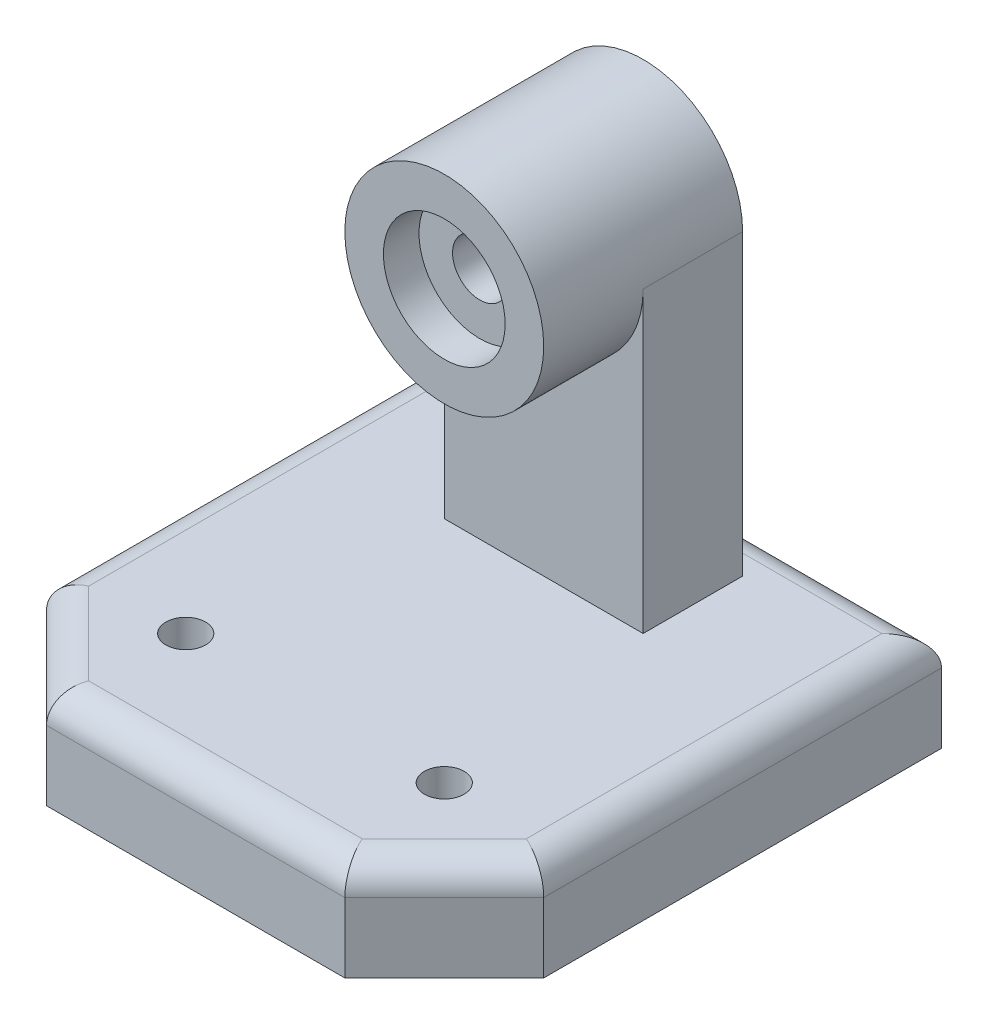
ISO-10303-21;
HEADER;
FILE_DESCRIPTION(('STEP AP214'),'2;1');
FILE_NAME('part.step','',(''),(''),'','','');
FILE_SCHEMA(('AUTOMOTIVE_DESIGN { 1 0 10303 214 1 1 1 1 }'));
ENDSEC;
DATA;
#1=APPLICATION_CONTEXT('core data for automotive mechanical design processes');
#2=APPLICATION_PROTOCOL_DEFINITION('international standard','automotive_design',2000,#1);
#3=PRODUCT_CONTEXT('',#1,'mechanical');
#4=PRODUCT('Part','Part','',(#3));
#5=PRODUCT_RELATED_PRODUCT_CATEGORY('part','',(#4));
#6=PRODUCT_DEFINITION_FORMATION('','',#4);
#7=PRODUCT_DEFINITION_CONTEXT('part definition',#1,'design');
#8=PRODUCT_DEFINITION('design','',#6,#7);
#9=PRODUCT_DEFINITION_SHAPE('','',#8);
#10=(LENGTH_UNIT() NAMED_UNIT(*) SI_UNIT(.MILLI.,.METRE.));
#11=(NAMED_UNIT(*) PLANE_ANGLE_UNIT() SI_UNIT($,.RADIAN.));
#12=(NAMED_UNIT(*) SI_UNIT($,.STERADIAN.) SOLID_ANGLE_UNIT());
#13=UNCERTAINTY_MEASURE_WITH_UNIT(LENGTH_MEASURE(1.E-05),#10,'distance_accuracy_value','');
#14=(GEOMETRIC_REPRESENTATION_CONTEXT(3) GLOBAL_UNCERTAINTY_ASSIGNED_CONTEXT((#13)) GLOBAL_UNIT_ASSIGNED_CONTEXT((#10,
#11,#12)) REPRESENTATION_CONTEXT('',''));
#15=CARTESIAN_POINT('',(0.,0.,0.));
#16=DIRECTION('',(0.,0.,1.));
#17=DIRECTION('',(1.,0.,0.));
#18=AXIS2_PLACEMENT_3D('',#15,#16,#17);
#19=CARTESIAN_POINT('',(0.,10.,0.));
#20=DIRECTION('',(0.,1.,0.));
#21=DIRECTION('',(0.,0.,1.));
#22=AXIS2_PLACEMENT_3D('',#19,#20,#21);
#23=PLANE('',#22);
#24=DIRECTION('',(0.,0.,-1.));
#25=VECTOR('',#24,1.);
#26=CARTESIAN_POINT('',(47.,10.,0.));
#27=LINE('',#26,#25);
#28=CARTESIAN_POINT('',(47.,10.,38.7573593128807));
#29=VERTEX_POINT('',#28);
#30=CARTESIAN_POINT('',(47.,10.,3.));
#31=VERTEX_POINT('',#30);
#32=EDGE_CURVE('E231',#29,#31,#27,.T.);
#33=ORIENTED_EDGE('',*,*,#32,.T.);
#34=DIRECTION('',(-1.,0.,0.));
#35=VECTOR('',#34,1.);
#36=CARTESIAN_POINT('',(0.,10.,3.));
#37=LINE('',#36,#35);
#38=CARTESIAN_POINT('',(3.,10.,3.));
#39=VERTEX_POINT('',#38);
#40=EDGE_CURVE('E233',#31,#39,#37,.T.);
#41=ORIENTED_EDGE('',*,*,#40,.T.);
#42=DIRECTION('',(0.,0.,1.));
#43=VECTOR('',#42,1.);
#44=CARTESIAN_POINT('',(3.,10.,40.));
#45=LINE('',#44,#43);
#46=CARTESIAN_POINT('',(3.,10.,38.7573593128807));
#47=VERTEX_POINT('',#46);
#48=EDGE_CURVE('E223',#39,#47,#45,.T.);
#49=ORIENTED_EDGE('',*,*,#48,.T.);
#50=DIRECTION('',(-0.707106781186546,0.,-0.707106781186549));
#51=VECTOR('',#50,1.);
#52=CARTESIAN_POINT('',(-17.8786796564403,10.,17.8786796564403));
#53=LINE('',#52,#51);
#54=CARTESIAN_POINT('',(11.2426406871193,10.,47.));
#55=VERTEX_POINT('',#54);
#56=EDGE_CURVE('E225',#47,#55,#53,.F.);
#57=ORIENTED_EDGE('',*,*,#56,.T.);
#58=DIRECTION('',(1.,0.,0.));
#59=VECTOR('',#58,1.);
#60=CARTESIAN_POINT('',(40.,10.,47.));
#61=LINE('',#60,#59);
#62=CARTESIAN_POINT('',(38.7573593128807,10.,47.));
#63=VERTEX_POINT('',#62);
#64=EDGE_CURVE('E227',#55,#63,#61,.T.);
#65=ORIENTED_EDGE('',*,*,#64,.T.);
#66=DIRECTION('',(-0.707106781186549,0.,0.707106781186547));
#67=VECTOR('',#66,1.);
#68=CARTESIAN_POINT('',(42.8786796564403,10.,42.8786796564404));
#69=LINE('',#68,#67);
#70=EDGE_CURVE('E229',#63,#29,#69,.F.);
#71=ORIENTED_EDGE('',*,*,#70,.T.);
#72=EDGE_LOOP('',(#33,#41,#49,#57,#65,#71));
#73=FACE_BOUND('',#72,.T.);
#74=CARTESIAN_POINT('',(12.,10.,38.));
#75=DIRECTION('',(0.,1.,0.));
#76=DIRECTION('',(0.,0.,1.));
#77=AXIS2_PLACEMENT_3D('',#74,#75,#76);
#78=CIRCLE('',#77,2.);
#79=CARTESIAN_POINT('',(12.,10.,40.));
#80=VERTEX_POINT('',#79);
#81=EDGE_CURVE('E260',#80,#80,#78,.T.);
#82=ORIENTED_EDGE('',*,*,#81,.F.);
#83=EDGE_LOOP('',(#82));
#84=FACE_BOUND('',#83,.T.);
#85=CARTESIAN_POINT('',(38.,10.,38.));
#86=DIRECTION('',(0.,1.,0.));
#87=DIRECTION('',(0.,0.,1.));
#88=AXIS2_PLACEMENT_3D('',#85,#86,#87);
#89=CIRCLE('',#88,2.);
#90=CARTESIAN_POINT('',(38.,10.,40.));
#91=VERTEX_POINT('',#90);
#92=EDGE_CURVE('E271',#91,#91,#89,.T.);
#93=ORIENTED_EDGE('',*,*,#92,.F.);
#94=EDGE_LOOP('',(#93));
#95=FACE_BOUND('',#94,.T.);
#96=DIRECTION('',(1.,0.,0.));
#97=VECTOR('',#96,1.);
#98=CARTESIAN_POINT('',(15.,10.,15.));
#99=LINE('',#98,#97);
#100=CARTESIAN_POINT('',(15.,10.,15.));
#101=VERTEX_POINT('',#100);
#102=CARTESIAN_POINT('',(35.,10.,15.));
#103=VERTEX_POINT('',#102);
#104=EDGE_CURVE('E184',#101,#103,#99,.T.);
#105=ORIENTED_EDGE('',*,*,#104,.F.);
#106=DIRECTION('',(0.,0.,1.));
#107=VECTOR('',#106,1.);
#108=CARTESIAN_POINT('',(15.,10.,5.));
#109=LINE('',#108,#107);
#110=CARTESIAN_POINT('',(15.,10.,5.));
#111=VERTEX_POINT('',#110);
#112=EDGE_CURVE('E180',#111,#101,#109,.T.);
#113=ORIENTED_EDGE('',*,*,#112,.F.);
#114=DIRECTION('',(-1.,0.,0.));
#115=VECTOR('',#114,1.);
#116=CARTESIAN_POINT('',(15.,10.,5.));
#117=LINE('',#116,#115);
#118=CARTESIAN_POINT('',(35.,10.,5.));
#119=VERTEX_POINT('',#118);
#120=EDGE_CURVE('E157',#119,#111,#117,.T.);
#121=ORIENTED_EDGE('',*,*,#120,.F.);
#122=DIRECTION('',(0.,0.,-1.));
#123=VECTOR('',#122,1.);
#124=CARTESIAN_POINT('',(35.,10.,5.));
#125=LINE('',#124,#123);
#126=EDGE_CURVE('E186',#103,#119,#125,.T.);
#127=ORIENTED_EDGE('',*,*,#126,.F.);
#128=EDGE_LOOP('',(#105,#113,#121,#127));
#129=FACE_BOUND('',#128,.T.);
#130=ADVANCED_FACE('F48',(#73,#84,#95,#129),#23,.T.);
#131=CARTESIAN_POINT('',(0.,10.,0.));
#132=DIRECTION('',(1.,0.,0.));
#133=DIRECTION('',(0.,0.,-1.));
#134=AXIS2_PLACEMENT_3D('',#131,#132,#133);
#135=PLANE('',#134);
#136=DIRECTION('',(0.,1.,0.));
#137=VECTOR('',#136,1.);
#138=CARTESIAN_POINT('',(0.,10.,40.));
#139=LINE('',#138,#137);
#140=CARTESIAN_POINT('',(0.,0.,40.));
#141=VERTEX_POINT('',#140);
#142=CARTESIAN_POINT('',(0.,7.,40.));
#143=VERTEX_POINT('',#142);
#144=EDGE_CURVE('E221',#141,#143,#139,.T.);
#145=ORIENTED_EDGE('',*,*,#144,.T.);
#146=DIRECTION('',(0.,0.,1.));
#147=VECTOR('',#146,1.);
#148=CARTESIAN_POINT('',(0.,7.,0.));
#149=LINE('',#148,#147);
#150=CARTESIAN_POINT('',(0.,7.,0.));
#151=VERTEX_POINT('',#150);
#152=EDGE_CURVE('E13',#143,#151,#149,.F.);
#153=ORIENTED_EDGE('',*,*,#152,.T.);
#154=DIRECTION('',(0.,-1.,0.));
#155=VECTOR('',#154,1.);
#156=CARTESIAN_POINT('',(0.,10.,0.));
#157=LINE('',#156,#155);
#158=CARTESIAN_POINT('',(0.,0.,0.));
#159=VERTEX_POINT('',#158);
#160=EDGE_CURVE('E207',#151,#159,#157,.T.);
#161=ORIENTED_EDGE('',*,*,#160,.T.);
#162=DIRECTION('',(0.,0.,1.));
#163=VECTOR('',#162,1.);
#164=CARTESIAN_POINT('',(0.,0.,0.));
#165=LINE('',#164,#163);
#166=EDGE_CURVE('E195',#159,#141,#165,.T.);
#167=ORIENTED_EDGE('',*,*,#166,.T.);
#168=EDGE_LOOP('',(#145,#153,#161,#167));
#169=FACE_BOUND('',#168,.T.);
#170=ADVANCED_FACE('F318',(#169),#135,.F.);
#171=CARTESIAN_POINT('',(0.,10.,50.));
#172=DIRECTION('',(0.,0.,-1.));
#173=DIRECTION('',(-1.,0.,0.));
#174=AXIS2_PLACEMENT_3D('',#171,#172,#173);
#175=PLANE('',#174);
#176=DIRECTION('',(0.,1.,0.));
#177=VECTOR('',#176,1.);
#178=CARTESIAN_POINT('',(40.,10.,50.));
#179=LINE('',#178,#177);
#180=CARTESIAN_POINT('',(40.,0.,50.));
#181=VERTEX_POINT('',#180);
#182=CARTESIAN_POINT('',(40.,7.,50.));
#183=VERTEX_POINT('',#182);
#184=EDGE_CURVE('E219',#181,#183,#179,.T.);
#185=ORIENTED_EDGE('',*,*,#184,.T.);
#186=DIRECTION('',(1.,0.,0.));
#187=VECTOR('',#186,1.);
#188=CARTESIAN_POINT('',(10.,7.,50.));
#189=LINE('',#188,#187);
#190=CARTESIAN_POINT('',(10.,7.,50.));
#191=VERTEX_POINT('',#190);
#192=EDGE_CURVE('E72',#183,#191,#189,.F.);
#193=ORIENTED_EDGE('',*,*,#192,.T.);
#194=DIRECTION('',(0.,-1.,0.));
#195=VECTOR('',#194,1.);
#196=CARTESIAN_POINT('',(10.,10.,50.));
#197=LINE('',#196,#195);
#198=CARTESIAN_POINT('',(10.,0.,50.));
#199=VERTEX_POINT('',#198);
#200=EDGE_CURVE('E217',#191,#199,#197,.T.);
#201=ORIENTED_EDGE('',*,*,#200,.T.);
#202=DIRECTION('',(1.,0.,0.));
#203=VECTOR('',#202,1.);
#204=CARTESIAN_POINT('',(0.,0.,50.));
#205=LINE('',#204,#203);
#206=EDGE_CURVE('E198',#199,#181,#205,.T.);
#207=ORIENTED_EDGE('',*,*,#206,.T.);
#208=EDGE_LOOP('',(#185,#193,#201,#207));
#209=FACE_BOUND('',#208,.T.);
#210=ADVANCED_FACE('F324',(#209),#175,.F.);
#211=CARTESIAN_POINT('',(50.,10.,0.));
#212=DIRECTION('',(-1.,0.,0.));
#213=DIRECTION('',(0.,0.,1.));
#214=AXIS2_PLACEMENT_3D('',#211,#212,#213);
#215=PLANE('',#214);
#216=DIRECTION('',(0.,-1.,0.));
#217=VECTOR('',#216,1.);
#218=CARTESIAN_POINT('',(50.,10.,0.));
#219=LINE('',#218,#217);
#220=CARTESIAN_POINT('',(50.,7.,0.));
#221=VERTEX_POINT('',#220);
#222=CARTESIAN_POINT('',(50.,0.,0.));
#223=VERTEX_POINT('',#222);
#224=EDGE_CURVE('E209',#221,#223,#219,.T.);
#225=ORIENTED_EDGE('',*,*,#224,.F.);
#226=DIRECTION('',(0.,0.,-1.));
#227=VECTOR('',#226,1.);
#228=CARTESIAN_POINT('',(50.,7.,40.));
#229=LINE('',#228,#227);
#230=CARTESIAN_POINT('',(50.,7.,40.));
#231=VERTEX_POINT('',#230);
#232=EDGE_CURVE('E239',#221,#231,#229,.F.);
#233=ORIENTED_EDGE('',*,*,#232,.T.);
#234=DIRECTION('',(0.,-1.,0.));
#235=VECTOR('',#234,1.);
#236=CARTESIAN_POINT('',(50.,10.,40.));
#237=LINE('',#236,#235);
#238=CARTESIAN_POINT('',(50.,0.,40.));
#239=VERTEX_POINT('',#238);
#240=EDGE_CURVE('E210',#231,#239,#237,.T.);
#241=ORIENTED_EDGE('',*,*,#240,.T.);
#242=DIRECTION('',(0.,0.,-1.));
#243=VECTOR('',#242,1.);
#244=CARTESIAN_POINT('',(50.,0.,0.));
#245=LINE('',#244,#243);
#246=EDGE_CURVE('E201',#239,#223,#245,.T.);
#247=ORIENTED_EDGE('',*,*,#246,.T.);
#248=EDGE_LOOP('',(#225,#233,#241,#247));
#249=FACE_BOUND('',#248,.T.);
#250=ADVANCED_FACE('F338',(#249),#215,.F.);
#251=CARTESIAN_POINT('',(0.,10.,0.));
#252=DIRECTION('',(0.,0.,1.));
#253=DIRECTION('',(1.,0.,0.));
#254=AXIS2_PLACEMENT_3D('',#251,#252,#253);
#255=PLANE('',#254);
#256=ORIENTED_EDGE('',*,*,#160,.F.);
#257=DIRECTION('',(-1.,0.,0.));
#258=VECTOR('',#257,1.);
#259=CARTESIAN_POINT('',(50.,7.,0.));
#260=LINE('',#259,#258);
#261=EDGE_CURVE('E236',#151,#221,#260,.F.);
#262=ORIENTED_EDGE('',*,*,#261,.T.);
#263=ORIENTED_EDGE('',*,*,#224,.T.);
#264=DIRECTION('',(-1.,0.,0.));
#265=VECTOR('',#264,1.);
#266=CARTESIAN_POINT('',(0.,0.,0.));
#267=LINE('',#266,#265);
#268=EDGE_CURVE('E204',#223,#159,#267,.T.);
#269=ORIENTED_EDGE('',*,*,#268,.T.);
#270=EDGE_LOOP('',(#256,#262,#263,#269));
#271=FACE_BOUND('',#270,.T.);
#272=ADVANCED_FACE('F334',(#271),#255,.F.);
#273=CARTESIAN_POINT('',(0.,0.,0.));
#274=DIRECTION('',(0.,1.,0.));
#275=DIRECTION('',(0.,0.,1.));
#276=AXIS2_PLACEMENT_3D('',#273,#274,#275);
#277=PLANE('',#276);
#278=CARTESIAN_POINT('',(12.,0.,38.));
#279=DIRECTION('',(0.,1.,0.));
#280=DIRECTION('',(0.,0.,1.));
#281=AXIS2_PLACEMENT_3D('',#278,#279,#280);
#282=CIRCLE('',#281,2.);
#283=CARTESIAN_POINT('',(12.,0.,40.));
#284=VERTEX_POINT('',#283);
#285=EDGE_CURVE('E266',#284,#284,#282,.T.);
#286=ORIENTED_EDGE('',*,*,#285,.T.);
#287=EDGE_LOOP('',(#286));
#288=FACE_BOUND('',#287,.T.);
#289=CARTESIAN_POINT('',(38.,0.,38.));
#290=DIRECTION('',(0.,1.,0.));
#291=DIRECTION('',(0.,0.,1.));
#292=AXIS2_PLACEMENT_3D('',#289,#290,#291);
#293=CIRCLE('',#292,1.99999999999999);
#294=CARTESIAN_POINT('',(38.,0.,40.));
#295=VERTEX_POINT('',#294);
#296=EDGE_CURVE('E276',#295,#295,#293,.T.);
#297=ORIENTED_EDGE('',*,*,#296,.T.);
#298=EDGE_LOOP('',(#297));
#299=FACE_BOUND('',#298,.T.);
#300=ORIENTED_EDGE('',*,*,#246,.F.);
#301=DIRECTION('',(0.707106781186549,0.,-0.707106781186547));
#302=VECTOR('',#301,1.);
#303=CARTESIAN_POINT('',(50.,0.,40.));
#304=LINE('',#303,#302);
#305=EDGE_CURVE('E215',#239,#181,#304,.F.);
#306=ORIENTED_EDGE('',*,*,#305,.T.);
#307=ORIENTED_EDGE('',*,*,#206,.F.);
#308=DIRECTION('',(0.707106781186546,0.,0.707106781186549));
#309=VECTOR('',#308,1.);
#310=CARTESIAN_POINT('',(10.,0.,50.));
#311=LINE('',#310,#309);
#312=EDGE_CURVE('E213',#199,#141,#311,.F.);
#313=ORIENTED_EDGE('',*,*,#312,.T.);
#314=ORIENTED_EDGE('',*,*,#166,.F.);
#315=ORIENTED_EDGE('',*,*,#268,.F.);
#316=EDGE_LOOP('',(#300,#306,#307,#313,#314,#315));
#317=FACE_BOUND('',#316,.T.);
#318=ADVANCED_FACE('F331',(#288,#299,#317),#277,.F.);
#319=CARTESIAN_POINT('',(15.,40.,5.));
#320=DIRECTION('',(1.,0.,0.));
#321=DIRECTION('',(0.,0.,-1.));
#322=AXIS2_PLACEMENT_3D('',#319,#320,#321);
#323=PLANE('',#322);
#324=ORIENTED_EDGE('',*,*,#112,.T.);
#325=DIRECTION('',(0.,-1.,0.));
#326=VECTOR('',#325,1.);
#327=CARTESIAN_POINT('',(15.,40.,15.));
#328=LINE('',#327,#326);
#329=CARTESIAN_POINT('',(15.,40.,15.));
#330=VERTEX_POINT('',#329);
#331=EDGE_CURVE('E152',#330,#101,#328,.T.);
#332=ORIENTED_EDGE('',*,*,#331,.F.);
#333=DIRECTION('',(0.,0.,1.));
#334=VECTOR('',#333,1.);
#335=CARTESIAN_POINT('',(15.,40.,5.));
#336=LINE('',#335,#334);
#337=CARTESIAN_POINT('',(15.,40.,5.));
#338=VERTEX_POINT('',#337);
#339=EDGE_CURVE('E146',#338,#330,#336,.T.);
#340=ORIENTED_EDGE('',*,*,#339,.F.);
#341=DIRECTION('',(0.,-1.,0.));
#342=VECTOR('',#341,1.);
#343=CARTESIAN_POINT('',(15.,40.,5.));
#344=LINE('',#343,#342);
#345=EDGE_CURVE('E150',#338,#111,#344,.T.);
#346=ORIENTED_EDGE('',*,*,#345,.T.);
#347=EDGE_LOOP('',(#324,#332,#340,#346));
#348=FACE_BOUND('',#347,.T.);
#349=ADVANCED_FACE('F149',(#348),#323,.F.);
#350=CARTESIAN_POINT('',(15.,40.,15.));
#351=DIRECTION('',(0.,0.,-1.));
#352=DIRECTION('',(-1.,0.,0.));
#353=AXIS2_PLACEMENT_3D('',#350,#351,#352);
#354=PLANE('',#353);
#355=DIRECTION('',(0.,-1.,0.));
#356=VECTOR('',#355,1.);
#357=CARTESIAN_POINT('',(35.,40.,15.));
#358=LINE('',#357,#356);
#359=CARTESIAN_POINT('',(35.,40.,15.));
#360=VERTEX_POINT('',#359);
#361=EDGE_CURVE('E191',#360,#103,#358,.T.);
#362=ORIENTED_EDGE('',*,*,#361,.F.);
#363=CARTESIAN_POINT('',(25.,40.,15.));
#364=DIRECTION('',(0.,0.,-1.));
#365=DIRECTION('',(-1.,0.,0.));
#366=AXIS2_PLACEMENT_3D('',#363,#364,#365);
#367=CIRCLE('',#366,10.);
#368=EDGE_CURVE('E173',#360,#330,#367,.T.);
#369=ORIENTED_EDGE('',*,*,#368,.T.);
#370=ORIENTED_EDGE('',*,*,#331,.T.);
#371=ORIENTED_EDGE('',*,*,#104,.T.);
#372=EDGE_LOOP('',(#362,#369,#370,#371));
#373=FACE_BOUND('',#372,.T.);
#374=ADVANCED_FACE('F459',(#373),#354,.F.);
#375=CARTESIAN_POINT('',(35.,40.,5.));
#376=DIRECTION('',(-1.,0.,0.));
#377=DIRECTION('',(0.,0.,1.));
#378=AXIS2_PLACEMENT_3D('',#375,#376,#377);
#379=PLANE('',#378);
#380=ORIENTED_EDGE('',*,*,#126,.T.);
#381=DIRECTION('',(0.,-1.,0.));
#382=VECTOR('',#381,1.);
#383=CARTESIAN_POINT('',(35.,40.,5.));
#384=LINE('',#383,#382);
#385=CARTESIAN_POINT('',(35.,40.,5.));
#386=VERTEX_POINT('',#385);
#387=EDGE_CURVE('E164',#386,#119,#384,.T.);
#388=ORIENTED_EDGE('',*,*,#387,.F.);
#389=DIRECTION('',(0.,0.,-1.));
#390=VECTOR('',#389,1.);
#391=CARTESIAN_POINT('',(35.,40.,5.));
#392=LINE('',#391,#390);
#393=EDGE_CURVE('E156',#360,#386,#392,.T.);
#394=ORIENTED_EDGE('',*,*,#393,.F.);
#395=ORIENTED_EDGE('',*,*,#361,.T.);
#396=EDGE_LOOP('',(#380,#388,#394,#395));
#397=FACE_BOUND('',#396,.T.);
#398=ADVANCED_FACE('F314',(#397),#379,.F.);
#399=CARTESIAN_POINT('',(15.,40.,5.));
#400=DIRECTION('',(0.,0.,1.));
#401=DIRECTION('',(1.,0.,0.));
#402=AXIS2_PLACEMENT_3D('',#399,#400,#401);
#403=PLANE('',#402);
#404=CARTESIAN_POINT('',(25.,40.,5.));
#405=DIRECTION('',(0.,0.,1.));
#406=DIRECTION('',(1.,0.,0.));
#407=AXIS2_PLACEMENT_3D('',#404,#405,#406);
#408=CIRCLE('',#407,2.75);
#409=CARTESIAN_POINT('',(27.75,40.,5.));
#410=VERTEX_POINT('',#409);
#411=EDGE_CURVE('E170',#410,#410,#408,.T.);
#412=ORIENTED_EDGE('',*,*,#411,.T.);
#413=EDGE_LOOP('',(#412));
#414=FACE_BOUND('',#413,.T.);
#415=ORIENTED_EDGE('',*,*,#345,.F.);
#416=CARTESIAN_POINT('',(25.,40.,5.));
#417=DIRECTION('',(0.,0.,-1.));
#418=DIRECTION('',(-1.,0.,0.));
#419=AXIS2_PLACEMENT_3D('',#416,#417,#418);
#420=CIRCLE('',#419,10.);
#421=EDGE_CURVE('E162',#338,#386,#420,.T.);
#422=ORIENTED_EDGE('',*,*,#421,.T.);
#423=ORIENTED_EDGE('',*,*,#387,.T.);
#424=ORIENTED_EDGE('',*,*,#120,.T.);
#425=EDGE_LOOP('',(#415,#422,#423,#424));
#426=FACE_BOUND('',#425,.T.);
#427=ADVANCED_FACE('F161',(#414,#426),#403,.F.);
#428=CARTESIAN_POINT('',(25.,40.,25.));
#429=DIRECTION('',(0.,0.,-1.));
#430=DIRECTION('',(-1.,0.,0.));
#431=AXIS2_PLACEMENT_3D('',#428,#429,#430);
#432=CYLINDRICAL_SURFACE('',#431,10.);
#433=CARTESIAN_POINT('',(25.,40.,25.));
#434=DIRECTION('',(0.,0.,-1.));
#435=DIRECTION('',(-1.,0.,0.));
#436=AXIS2_PLACEMENT_3D('',#433,#434,#435);
#437=CIRCLE('',#436,10.);
#438=CARTESIAN_POINT('',(15.,40.,25.));
#439=VERTEX_POINT('',#438);
#440=EDGE_CURVE('E169',#439,#439,#437,.T.);
#441=ORIENTED_EDGE('',*,*,#440,.T.);
#442=EDGE_LOOP('',(#441));
#443=FACE_BOUND('',#442,.T.);
#444=ORIENTED_EDGE('',*,*,#368,.F.);
#445=ORIENTED_EDGE('',*,*,#393,.T.);
#446=ORIENTED_EDGE('',*,*,#421,.F.);
#447=ORIENTED_EDGE('',*,*,#339,.T.);
#448=EDGE_LOOP('',(#444,#445,#446,#447));
#449=FACE_BOUND('',#448,.T.);
#450=ADVANCED_FACE('F167',(#443,#449),#432,.T.);
#451=CARTESIAN_POINT('',(25.,40.,25.));
#452=DIRECTION('',(0.,0.,-1.));
#453=DIRECTION('',(-1.,0.,0.));
#454=AXIS2_PLACEMENT_3D('',#451,#452,#453);
#455=PLANE('',#454);
#456=CARTESIAN_POINT('',(25.,40.,25.));
#457=DIRECTION('',(0.,0.,1.));
#458=DIRECTION('',(1.,0.,0.));
#459=AXIS2_PLACEMENT_3D('',#456,#457,#458);
#460=CIRCLE('',#459,6.12);
#461=CARTESIAN_POINT('',(31.12,40.,25.));
#462=VERTEX_POINT('',#461);
#463=EDGE_CURVE('E279',#462,#462,#460,.T.);
#464=ORIENTED_EDGE('',*,*,#463,.F.);
#465=EDGE_LOOP('',(#464));
#466=FACE_BOUND('',#465,.T.);
#467=ORIENTED_EDGE('',*,*,#440,.F.);
#468=EDGE_LOOP('',(#467));
#469=FACE_BOUND('',#468,.T.);
#470=ADVANCED_FACE('F303',(#466,#469),#455,.F.);
#471=CARTESIAN_POINT('',(25.,40.,25.));
#472=DIRECTION('',(0.,0.,1.));
#473=DIRECTION('',(1.,0.,0.));
#474=AXIS2_PLACEMENT_3D('',#471,#472,#473);
#475=CYLINDRICAL_SURFACE('',#474,2.75);
#476=CARTESIAN_POINT('',(25.,40.,21.42));
#477=DIRECTION('',(0.,0.,1.));
#478=DIRECTION('',(1.,0.,0.));
#479=AXIS2_PLACEMENT_3D('',#476,#477,#478);
#480=CIRCLE('',#479,2.75);
#481=CARTESIAN_POINT('',(27.75,40.,21.42));
#482=VERTEX_POINT('',#481);
#483=EDGE_CURVE('E176',#482,#482,#480,.T.);
#484=ORIENTED_EDGE('',*,*,#483,.T.);
#485=EDGE_LOOP('',(#484));
#486=FACE_BOUND('',#485,.T.);
#487=ORIENTED_EDGE('',*,*,#411,.F.);
#488=EDGE_LOOP('',(#487));
#489=FACE_BOUND('',#488,.T.);
#490=ADVANCED_FACE('F287',(#486,#489),#475,.F.);
#491=CARTESIAN_POINT('',(27.75,40.,21.42));
#492=DIRECTION('',(0.,0.,-1.));
#493=DIRECTION('',(-1.,0.,0.));
#494=AXIS2_PLACEMENT_3D('',#491,#492,#493);
#495=PLANE('',#494);
#496=ORIENTED_EDGE('',*,*,#483,.F.);
#497=EDGE_LOOP('',(#496));
#498=FACE_BOUND('',#497,.T.);
#499=CARTESIAN_POINT('',(25.,40.,21.42));
#500=DIRECTION('',(0.,0.,1.));
#501=DIRECTION('',(1.,0.,0.));
#502=AXIS2_PLACEMENT_3D('',#499,#500,#501);
#503=CIRCLE('',#502,6.12);
#504=CARTESIAN_POINT('',(31.12,40.,21.42));
#505=VERTEX_POINT('',#504);
#506=EDGE_CURVE('E282',#505,#505,#503,.T.);
#507=ORIENTED_EDGE('',*,*,#506,.T.);
#508=EDGE_LOOP('',(#507));
#509=FACE_BOUND('',#508,.T.);
#510=ADVANCED_FACE('F290',(#498,#509),#495,.F.);
#511=CARTESIAN_POINT('',(25.,40.,25.));
#512=DIRECTION('',(0.,0.,1.));
#513=DIRECTION('',(1.,0.,0.));
#514=AXIS2_PLACEMENT_3D('',#511,#512,#513);
#515=CYLINDRICAL_SURFACE('',#514,6.12);
#516=ORIENTED_EDGE('',*,*,#506,.F.);
#517=EDGE_LOOP('',(#516));
#518=FACE_BOUND('',#517,.T.);
#519=ORIENTED_EDGE('',*,*,#463,.T.);
#520=EDGE_LOOP('',(#519));
#521=FACE_BOUND('',#520,.T.);
#522=ADVANCED_FACE('F293',(#518,#521),#515,.F.);
#523=CARTESIAN_POINT('',(38.,10.,38.));
#524=DIRECTION('',(0.,1.,0.));
#525=DIRECTION('',(0.,0.,1.));
#526=AXIS2_PLACEMENT_3D('',#523,#524,#525);
#527=CYLINDRICAL_SURFACE('',#526,2.);
#528=ORIENTED_EDGE('',*,*,#296,.F.);
#529=EDGE_LOOP('',(#528));
#530=FACE_BOUND('',#529,.T.);
#531=ORIENTED_EDGE('',*,*,#92,.T.);
#532=EDGE_LOOP('',(#531));
#533=FACE_BOUND('',#532,.T.);
#534=ADVANCED_FACE('F299',(#530,#533),#527,.F.);
#535=CARTESIAN_POINT('',(12.,10.,38.));
#536=DIRECTION('',(0.,1.,0.));
#537=DIRECTION('',(0.,0.,1.));
#538=AXIS2_PLACEMENT_3D('',#535,#536,#537);
#539=CYLINDRICAL_SURFACE('',#538,2.);
#540=ORIENTED_EDGE('',*,*,#285,.F.);
#541=EDGE_LOOP('',(#540));
#542=FACE_BOUND('',#541,.T.);
#543=ORIENTED_EDGE('',*,*,#81,.T.);
#544=EDGE_LOOP('',(#543));
#545=FACE_BOUND('',#544,.T.);
#546=ADVANCED_FACE('F349',(#542,#545),#539,.F.);
#547=CARTESIAN_POINT('',(50.,10.,40.));
#548=DIRECTION('',(-0.707106781186547,0.,-0.707106781186549));
#549=DIRECTION('',(0.,-1.,0.));
#550=AXIS2_PLACEMENT_3D('',#547,#548,#549);
#551=PLANE('',#550);
#552=ORIENTED_EDGE('',*,*,#240,.F.);
#553=DIRECTION('',(0.707106781186549,0.,-0.707106781186547));
#554=VECTOR('',#553,1.);
#555=CARTESIAN_POINT('',(50.,7.,40.));
#556=LINE('',#555,#554);
#557=EDGE_CURVE('E241',#231,#183,#556,.F.);
#558=ORIENTED_EDGE('',*,*,#557,.T.);
#559=ORIENTED_EDGE('',*,*,#184,.F.);
#560=ORIENTED_EDGE('',*,*,#305,.F.);
#561=EDGE_LOOP('',(#552,#558,#559,#560));
#562=FACE_BOUND('',#561,.T.);
#563=ADVANCED_FACE('F345',(#562),#551,.F.);
#564=CARTESIAN_POINT('',(10.,10.,50.));
#565=DIRECTION('',(0.707106781186549,0.,-0.707106781186546));
#566=DIRECTION('',(0.,-1.,0.));
#567=AXIS2_PLACEMENT_3D('',#564,#565,#566);
#568=PLANE('',#567);
#569=ORIENTED_EDGE('',*,*,#200,.F.);
#570=DIRECTION('',(0.707106781186546,0.,0.707106781186549));
#571=VECTOR('',#570,1.);
#572=CARTESIAN_POINT('',(10.,7.,50.));
#573=LINE('',#572,#571);
#574=EDGE_CURVE('E57',#191,#143,#573,.F.);
#575=ORIENTED_EDGE('',*,*,#574,.T.);
#576=ORIENTED_EDGE('',*,*,#144,.F.);
#577=ORIENTED_EDGE('',*,*,#312,.F.);
#578=EDGE_LOOP('',(#569,#575,#576,#577));
#579=FACE_BOUND('',#578,.T.);
#580=ADVANCED_FACE('F348',(#579),#568,.F.);
#581=CARTESIAN_POINT('',(0.,7.,47.));
#582=DIRECTION('',(-1.,0.,0.));
#583=DIRECTION('',(0.,0.,1.));
#584=AXIS2_PLACEMENT_3D('',#581,#582,#583);
#585=CYLINDRICAL_SURFACE('',#584,3.);
#586=CARTESIAN_POINT('',(11.2426406871193,7.,47.));
#587=DIRECTION('',(-0.923879532511286,0.,-0.382683432365091));
#588=DIRECTION('',(0.382683432365091,0.,-0.923879532511286));
#589=AXIS2_PLACEMENT_3D('',#586,#587,#588);
#590=ELLIPSE('',#589,3.24717660087718,3.);
#591=EDGE_CURVE('E254',#191,#55,#590,.T.);
#592=ORIENTED_EDGE('',*,*,#591,.F.);
#593=ORIENTED_EDGE('',*,*,#192,.F.);
#594=CARTESIAN_POINT('',(38.7573593128807,7.,47.));
#595=DIRECTION('',(-0.923879532511287,0.,0.382683432365089));
#596=DIRECTION('',(-0.382683432365089,0.,-0.923879532511287));
#597=AXIS2_PLACEMENT_3D('',#594,#595,#596);
#598=ELLIPSE('',#597,3.24717660087718,3.);
#599=EDGE_CURVE('E52',#63,#183,#598,.F.);
#600=ORIENTED_EDGE('',*,*,#599,.F.);
#601=ORIENTED_EDGE('',*,*,#64,.F.);
#602=EDGE_LOOP('',(#592,#593,#600,#601));
#603=FACE_BOUND('',#602,.T.);
#604=ADVANCED_FACE('F50',(#603),#585,.T.);
#605=CARTESIAN_POINT('',(42.8786796564403,7.,42.8786796564404));
#606=DIRECTION('',(-0.707106781186549,0.,0.707106781186547));
#607=DIRECTION('',(0.707106781186547,0.,0.707106781186549));
#608=AXIS2_PLACEMENT_3D('',#605,#606,#607);
#609=CYLINDRICAL_SURFACE('',#608,3.);
#610=ORIENTED_EDGE('',*,*,#599,.T.);
#611=ORIENTED_EDGE('',*,*,#557,.F.);
#612=CARTESIAN_POINT('',(47.,7.,38.7573593128807));
#613=DIRECTION('',(-0.38268343236509,0.,0.923879532511287));
#614=DIRECTION('',(-0.923879532511287,0.,-0.38268343236509));
#615=AXIS2_PLACEMENT_3D('',#612,#613,#614);
#616=ELLIPSE('',#615,3.24717660087718,3.);
#617=EDGE_CURVE('E252',#29,#231,#616,.F.);
#618=ORIENTED_EDGE('',*,*,#617,.F.);
#619=ORIENTED_EDGE('',*,*,#70,.F.);
#620=EDGE_LOOP('',(#610,#611,#618,#619));
#621=FACE_BOUND('',#620,.T.);
#622=ADVANCED_FACE('F367',(#621),#609,.T.);
#623=CARTESIAN_POINT('',(-17.8786796564403,7.,17.8786796564403));
#624=DIRECTION('',(-0.707106781186546,0.,-0.707106781186549));
#625=DIRECTION('',(-0.707106781186549,0.,0.707106781186546));
#626=AXIS2_PLACEMENT_3D('',#623,#624,#625);
#627=CYLINDRICAL_SURFACE('',#626,3.);
#628=ORIENTED_EDGE('',*,*,#591,.T.);
#629=ORIENTED_EDGE('',*,*,#56,.F.);
#630=CARTESIAN_POINT('',(3.,7.,38.7573593128807));
#631=DIRECTION('',(-0.382683432365089,0.,-0.923879532511287));
#632=DIRECTION('',(0.923879532511287,0.,-0.382683432365089));
#633=AXIS2_PLACEMENT_3D('',#630,#631,#632);
#634=ELLIPSE('',#633,3.24717660087718,3.);
#635=EDGE_CURVE('E249',#143,#47,#634,.T.);
#636=ORIENTED_EDGE('',*,*,#635,.F.);
#637=ORIENTED_EDGE('',*,*,#574,.F.);
#638=EDGE_LOOP('',(#628,#629,#636,#637));
#639=FACE_BOUND('',#638,.T.);
#640=ADVANCED_FACE('F364',(#639),#627,.T.);
#641=CARTESIAN_POINT('',(47.,7.,0.));
#642=DIRECTION('',(0.,0.,1.));
#643=DIRECTION('',(1.,0.,0.));
#644=AXIS2_PLACEMENT_3D('',#641,#642,#643);
#645=CYLINDRICAL_SURFACE('',#644,3.);
#646=ORIENTED_EDGE('',*,*,#617,.T.);
#647=ORIENTED_EDGE('',*,*,#232,.F.);
#648=CARTESIAN_POINT('',(47.,7.,3.));
#649=DIRECTION('',(0.707106781186548,0.,0.707106781186547));
#650=DIRECTION('',(-0.707106781186547,0.,0.707106781186548));
#651=AXIS2_PLACEMENT_3D('',#648,#649,#650);
#652=ELLIPSE('',#651,4.24264068711928,3.);
#653=EDGE_CURVE('E247',#31,#221,#652,.F.);
#654=ORIENTED_EDGE('',*,*,#653,.F.);
#655=ORIENTED_EDGE('',*,*,#32,.F.);
#656=EDGE_LOOP('',(#646,#647,#654,#655));
#657=FACE_BOUND('',#656,.T.);
#658=ADVANCED_FACE('F360',(#657),#645,.T.);
#659=CARTESIAN_POINT('',(3.,7.,0.));
#660=DIRECTION('',(0.,0.,-1.));
#661=DIRECTION('',(-1.,0.,0.));
#662=AXIS2_PLACEMENT_3D('',#659,#660,#661);
#663=CYLINDRICAL_SURFACE('',#662,3.);
#664=ORIENTED_EDGE('',*,*,#635,.T.);
#665=ORIENTED_EDGE('',*,*,#48,.F.);
#666=CARTESIAN_POINT('',(3.,7.,3.));
#667=DIRECTION('',(0.707106781186547,0.,-0.707106781186547));
#668=DIRECTION('',(-0.707106781186547,0.,-0.707106781186547));
#669=AXIS2_PLACEMENT_3D('',#666,#667,#668);
#670=ELLIPSE('',#669,4.24264068711928,3.);
#671=EDGE_CURVE('E245',#151,#39,#670,.T.);
#672=ORIENTED_EDGE('',*,*,#671,.F.);
#673=ORIENTED_EDGE('',*,*,#152,.F.);
#674=EDGE_LOOP('',(#664,#665,#672,#673));
#675=FACE_BOUND('',#674,.T.);
#676=ADVANCED_FACE('F356',(#675),#663,.T.);
#677=CARTESIAN_POINT('',(0.,7.,3.));
#678=DIRECTION('',(1.,0.,0.));
#679=DIRECTION('',(0.,0.,-1.));
#680=AXIS2_PLACEMENT_3D('',#677,#678,#679);
#681=CYLINDRICAL_SURFACE('',#680,3.);
#682=ORIENTED_EDGE('',*,*,#653,.T.);
#683=ORIENTED_EDGE('',*,*,#261,.F.);
#684=ORIENTED_EDGE('',*,*,#671,.T.);
#685=ORIENTED_EDGE('',*,*,#40,.F.);
#686=EDGE_LOOP('',(#682,#683,#684,#685));
#687=FACE_BOUND('',#686,.T.);
#688=ADVANCED_FACE('F353',(#687),#681,.T.);
#689=CLOSED_SHELL('',(#130,#170,#210,#250,#272,#318,#349,#374,#398,#427,#450,#470,#490,#510,
#522,#534,#546,#563,#580,#604,#622,#640,#658,#676,#688));
#690=MANIFOLD_SOLID_BREP('B2',#689);
#691=ADVANCED_BREP_SHAPE_REPRESENTATION('',(#18,#690),#14);
#692=SHAPE_DEFINITION_REPRESENTATION(#9,#691);
ENDSEC;
END-ISO-10303-21;
